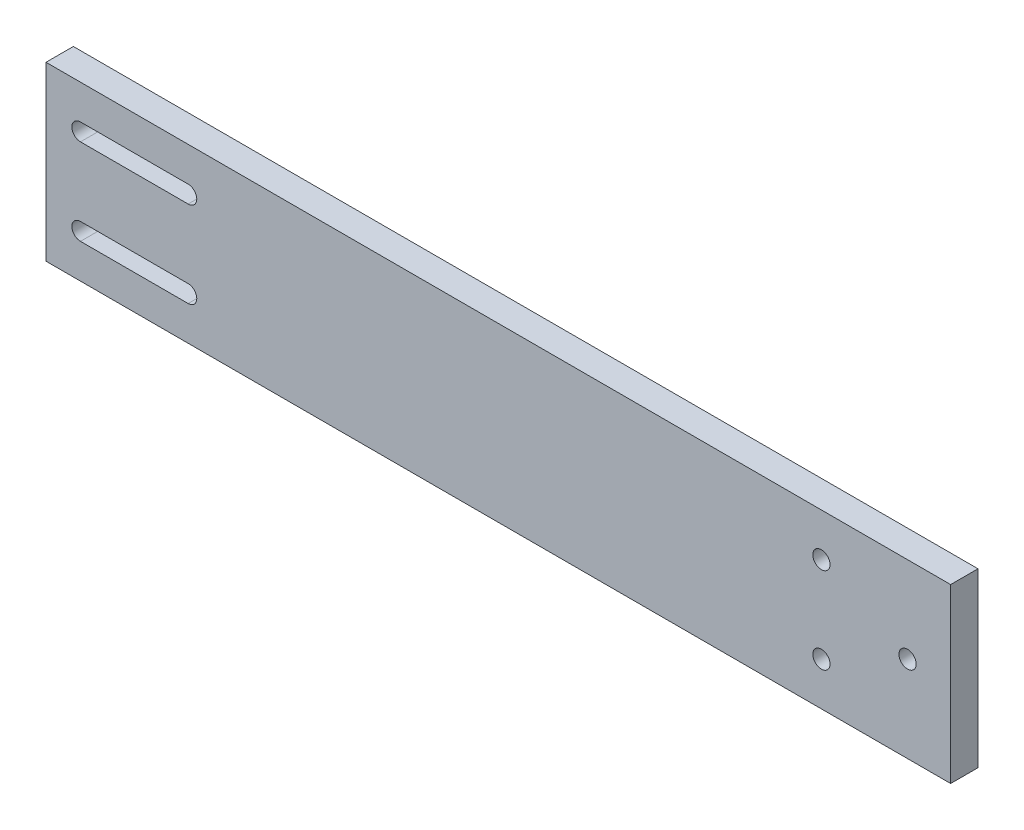
ISO-10303-21;
HEADER;
FILE_DESCRIPTION(('STEP AP214'),'2;1');
FILE_NAME('part.step','',(''),(''),'','','');
FILE_SCHEMA(('AUTOMOTIVE_DESIGN { 1 0 10303 214 1 1 1 1 }'));
ENDSEC;
DATA;
#1=APPLICATION_CONTEXT('core data for automotive mechanical design processes');
#2=APPLICATION_PROTOCOL_DEFINITION('international standard','automotive_design',2000,#1);
#3=PRODUCT_CONTEXT('',#1,'mechanical');
#4=PRODUCT('Part','Part','',(#3));
#5=PRODUCT_RELATED_PRODUCT_CATEGORY('part','',(#4));
#6=PRODUCT_DEFINITION_FORMATION('','',#4);
#7=PRODUCT_DEFINITION_CONTEXT('part definition',#1,'design');
#8=PRODUCT_DEFINITION('design','',#6,#7);
#9=PRODUCT_DEFINITION_SHAPE('','',#8);
#10=(LENGTH_UNIT() NAMED_UNIT(*) SI_UNIT(.MILLI.,.METRE.));
#11=(NAMED_UNIT(*) PLANE_ANGLE_UNIT() SI_UNIT($,.RADIAN.));
#12=(NAMED_UNIT(*) SI_UNIT($,.STERADIAN.) SOLID_ANGLE_UNIT());
#13=UNCERTAINTY_MEASURE_WITH_UNIT(LENGTH_MEASURE(1.E-05),#10,'distance_accuracy_value','');
#14=(GEOMETRIC_REPRESENTATION_CONTEXT(3) GLOBAL_UNCERTAINTY_ASSIGNED_CONTEXT((#13)) GLOBAL_UNIT_ASSIGNED_CONTEXT((#10,
#11,#12)) REPRESENTATION_CONTEXT('',''));
#15=CARTESIAN_POINT('',(0.,0.,0.));
#16=DIRECTION('',(0.,0.,1.));
#17=DIRECTION('',(1.,0.,0.));
#18=AXIS2_PLACEMENT_3D('',#15,#16,#17);
#19=CARTESIAN_POINT('',(0.,0.,6.35));
#20=DIRECTION('',(0.,0.,-1.));
#21=DIRECTION('',(-1.,0.,0.));
#22=AXIS2_PLACEMENT_3D('',#19,#20,#21);
#23=PLANE('',#22);
#24=CARTESIAN_POINT('',(8.,30.,6.35));
#25=DIRECTION('',(0.,0.,1.));
#26=DIRECTION('',(1.,0.,0.));
#27=AXIS2_PLACEMENT_3D('',#24,#25,#26);
#28=CIRCLE('',#27,2.);
#29=CARTESIAN_POINT('',(8.,32.,6.35));
#30=VERTEX_POINT('',#29);
#31=CARTESIAN_POINT('',(8.,28.,6.35));
#32=VERTEX_POINT('',#31);
#33=EDGE_CURVE('E180',#30,#32,#28,.T.);
#34=ORIENTED_EDGE('',*,*,#33,.F.);
#35=DIRECTION('',(-1.,0.,0.));
#36=VECTOR('',#35,1.);
#37=CARTESIAN_POINT('',(8.,32.,6.35));
#38=LINE('',#37,#36);
#39=CARTESIAN_POINT('',(33.,32.,6.35));
#40=VERTEX_POINT('',#39);
#41=EDGE_CURVE('E191',#40,#30,#38,.T.);
#42=ORIENTED_EDGE('',*,*,#41,.F.);
#43=CARTESIAN_POINT('',(33.,30.,6.35));
#44=DIRECTION('',(0.,0.,1.));
#45=DIRECTION('',(-1.,0.,0.));
#46=AXIS2_PLACEMENT_3D('',#43,#44,#45);
#47=CIRCLE('',#46,2.);
#48=CARTESIAN_POINT('',(33.,28.,6.35));
#49=VERTEX_POINT('',#48);
#50=EDGE_CURVE('E187',#49,#40,#47,.T.);
#51=ORIENTED_EDGE('',*,*,#50,.F.);
#52=DIRECTION('',(1.,0.,0.));
#53=VECTOR('',#52,1.);
#54=CARTESIAN_POINT('',(8.,28.,6.35));
#55=LINE('',#54,#53);
#56=EDGE_CURVE('E183',#32,#49,#55,.T.);
#57=ORIENTED_EDGE('',*,*,#56,.F.);
#58=EDGE_LOOP('',(#34,#42,#51,#57));
#59=FACE_BOUND('',#58,.T.);
#60=DIRECTION('',(0.,-1.,0.));
#61=VECTOR('',#60,1.);
#62=CARTESIAN_POINT('',(0.,0.,6.35));
#63=LINE('',#62,#61);
#64=CARTESIAN_POINT('',(0.,40.,6.35));
#65=VERTEX_POINT('',#64);
#66=CARTESIAN_POINT('',(0.,0.,6.35));
#67=VERTEX_POINT('',#66);
#68=EDGE_CURVE('E239',#65,#67,#63,.T.);
#69=ORIENTED_EDGE('',*,*,#68,.T.);
#70=DIRECTION('',(1.,0.,0.));
#71=VECTOR('',#70,1.);
#72=CARTESIAN_POINT('',(0.,0.,6.35));
#73=LINE('',#72,#71);
#74=CARTESIAN_POINT('',(210.,0.,6.35));
#75=VERTEX_POINT('',#74);
#76=EDGE_CURVE('E243',#67,#75,#73,.T.);
#77=ORIENTED_EDGE('',*,*,#76,.T.);
#78=DIRECTION('',(0.,1.,0.));
#79=VECTOR('',#78,1.);
#80=CARTESIAN_POINT('',(210.,0.,6.35));
#81=LINE('',#80,#79);
#82=CARTESIAN_POINT('',(210.,40.,6.35));
#83=VERTEX_POINT('',#82);
#84=EDGE_CURVE('E247',#75,#83,#81,.T.);
#85=ORIENTED_EDGE('',*,*,#84,.T.);
#86=DIRECTION('',(-1.,0.,0.));
#87=VECTOR('',#86,1.);
#88=CARTESIAN_POINT('',(0.,40.,6.35));
#89=LINE('',#88,#87);
#90=EDGE_CURVE('E250',#83,#65,#89,.T.);
#91=ORIENTED_EDGE('',*,*,#90,.T.);
#92=EDGE_LOOP('',(#69,#77,#85,#91));
#93=FACE_BOUND('',#92,.T.);
#94=CARTESIAN_POINT('',(180.,30.,6.35));
#95=DIRECTION('',(0.,0.,1.));
#96=DIRECTION('',(1.,0.,0.));
#97=AXIS2_PLACEMENT_3D('',#94,#95,#96);
#98=CIRCLE('',#97,2.);
#99=CARTESIAN_POINT('',(182.,30.,6.35));
#100=VERTEX_POINT('',#99);
#101=EDGE_CURVE('E231',#100,#100,#98,.T.);
#102=ORIENTED_EDGE('',*,*,#101,.F.);
#103=EDGE_LOOP('',(#102));
#104=FACE_BOUND('',#103,.T.);
#105=CARTESIAN_POINT('',(180.,10.,6.35));
#106=DIRECTION('',(0.,0.,1.));
#107=DIRECTION('',(1.,0.,0.));
#108=AXIS2_PLACEMENT_3D('',#105,#106,#107);
#109=CIRCLE('',#108,2.);
#110=CARTESIAN_POINT('',(182.,10.,6.35));
#111=VERTEX_POINT('',#110);
#112=EDGE_CURVE('E223',#111,#111,#109,.T.);
#113=ORIENTED_EDGE('',*,*,#112,.F.);
#114=EDGE_LOOP('',(#113));
#115=FACE_BOUND('',#114,.T.);
#116=CARTESIAN_POINT('',(8.,10.,6.35));
#117=DIRECTION('',(0.,0.,1.));
#118=DIRECTION('',(1.,0.,0.));
#119=AXIS2_PLACEMENT_3D('',#116,#117,#118);
#120=CIRCLE('',#119,2.);
#121=CARTESIAN_POINT('',(8.,12.,6.35));
#122=VERTEX_POINT('',#121);
#123=CARTESIAN_POINT('',(8.,8.,6.35));
#124=VERTEX_POINT('',#123);
#125=EDGE_CURVE('E129',#122,#124,#120,.T.);
#126=ORIENTED_EDGE('',*,*,#125,.F.);
#127=DIRECTION('',(-1.,0.,0.));
#128=VECTOR('',#127,1.);
#129=CARTESIAN_POINT('',(8.,12.,6.35));
#130=LINE('',#129,#128);
#131=CARTESIAN_POINT('',(33.,12.,6.35));
#132=VERTEX_POINT('',#131);
#133=EDGE_CURVE('E156',#132,#122,#130,.T.);
#134=ORIENTED_EDGE('',*,*,#133,.F.);
#135=CARTESIAN_POINT('',(33.,10.,6.35));
#136=DIRECTION('',(0.,0.,1.));
#137=DIRECTION('',(-1.,0.,0.));
#138=AXIS2_PLACEMENT_3D('',#135,#136,#137);
#139=CIRCLE('',#138,2.);
#140=CARTESIAN_POINT('',(33.,8.,6.35));
#141=VERTEX_POINT('',#140);
#142=EDGE_CURVE('E152',#141,#132,#139,.T.);
#143=ORIENTED_EDGE('',*,*,#142,.F.);
#144=DIRECTION('',(1.,0.,0.));
#145=VECTOR('',#144,1.);
#146=CARTESIAN_POINT('',(8.,8.,6.35));
#147=LINE('',#146,#145);
#148=EDGE_CURVE('E138',#124,#141,#147,.T.);
#149=ORIENTED_EDGE('',*,*,#148,.F.);
#150=EDGE_LOOP('',(#126,#134,#143,#149));
#151=FACE_BOUND('',#150,.T.);
#152=CARTESIAN_POINT('',(200.,20.,6.35));
#153=DIRECTION('',(0.,0.,1.));
#154=DIRECTION('',(1.,0.,0.));
#155=AXIS2_PLACEMENT_3D('',#152,#153,#154);
#156=CIRCLE('',#155,2.);
#157=CARTESIAN_POINT('',(202.,20.,6.35));
#158=VERTEX_POINT('',#157);
#159=EDGE_CURVE('E164',#158,#158,#156,.T.);
#160=ORIENTED_EDGE('',*,*,#159,.F.);
#161=EDGE_LOOP('',(#160));
#162=FACE_BOUND('',#161,.T.);
#163=ADVANCED_FACE('F39',(#59,#93,#104,#115,#151,#162),#23,.F.);
#164=CARTESIAN_POINT('',(0.,0.,0.));
#165=DIRECTION('',(0.,0.,-1.));
#166=DIRECTION('',(-1.,0.,0.));
#167=AXIS2_PLACEMENT_3D('',#164,#165,#166);
#168=PLANE('',#167);
#169=DIRECTION('',(-1.,0.,0.));
#170=VECTOR('',#169,1.);
#171=CARTESIAN_POINT('',(8.,12.,0.));
#172=LINE('',#171,#170);
#173=CARTESIAN_POINT('',(33.,12.,0.));
#174=VERTEX_POINT('',#173);
#175=CARTESIAN_POINT('',(8.,12.,0.));
#176=VERTEX_POINT('',#175);
#177=EDGE_CURVE('E139',#174,#176,#172,.T.);
#178=ORIENTED_EDGE('',*,*,#177,.T.);
#179=CARTESIAN_POINT('',(8.,10.,0.));
#180=DIRECTION('',(0.,0.,1.));
#181=DIRECTION('',(1.,0.,0.));
#182=AXIS2_PLACEMENT_3D('',#179,#180,#181);
#183=CIRCLE('',#182,2.);
#184=CARTESIAN_POINT('',(8.,8.,0.));
#185=VERTEX_POINT('',#184);
#186=EDGE_CURVE('E63',#176,#185,#183,.T.);
#187=ORIENTED_EDGE('',*,*,#186,.T.);
#188=DIRECTION('',(1.,0.,0.));
#189=VECTOR('',#188,1.);
#190=CARTESIAN_POINT('',(8.,8.,0.));
#191=LINE('',#190,#189);
#192=CARTESIAN_POINT('',(33.,8.,0.));
#193=VERTEX_POINT('',#192);
#194=EDGE_CURVE('E145',#185,#193,#191,.T.);
#195=ORIENTED_EDGE('',*,*,#194,.T.);
#196=CARTESIAN_POINT('',(33.,10.,0.));
#197=DIRECTION('',(0.,0.,1.));
#198=DIRECTION('',(-1.,0.,0.));
#199=AXIS2_PLACEMENT_3D('',#196,#197,#198);
#200=CIRCLE('',#199,2.);
#201=EDGE_CURVE('E167',#193,#174,#200,.T.);
#202=ORIENTED_EDGE('',*,*,#201,.T.);
#203=EDGE_LOOP('',(#178,#187,#195,#202));
#204=FACE_BOUND('',#203,.T.);
#205=DIRECTION('',(-1.,0.,0.));
#206=VECTOR('',#205,1.);
#207=CARTESIAN_POINT('',(8.,32.,0.));
#208=LINE('',#207,#206);
#209=CARTESIAN_POINT('',(33.,32.,0.));
#210=VERTEX_POINT('',#209);
#211=CARTESIAN_POINT('',(8.,32.,0.));
#212=VERTEX_POINT('',#211);
#213=EDGE_CURVE('E184',#210,#212,#208,.T.);
#214=ORIENTED_EDGE('',*,*,#213,.T.);
#215=CARTESIAN_POINT('',(8.,30.,0.));
#216=DIRECTION('',(0.,0.,1.));
#217=DIRECTION('',(1.,0.,0.));
#218=AXIS2_PLACEMENT_3D('',#215,#216,#217);
#219=CIRCLE('',#218,2.);
#220=CARTESIAN_POINT('',(8.,28.,0.));
#221=VERTEX_POINT('',#220);
#222=EDGE_CURVE('E147',#212,#221,#219,.T.);
#223=ORIENTED_EDGE('',*,*,#222,.T.);
#224=DIRECTION('',(1.,0.,0.));
#225=VECTOR('',#224,1.);
#226=CARTESIAN_POINT('',(8.,28.,0.));
#227=LINE('',#226,#225);
#228=CARTESIAN_POINT('',(33.,28.,0.));
#229=VERTEX_POINT('',#228);
#230=EDGE_CURVE('E198',#221,#229,#227,.T.);
#231=ORIENTED_EDGE('',*,*,#230,.T.);
#232=CARTESIAN_POINT('',(33.,30.,0.));
#233=DIRECTION('',(0.,0.,1.));
#234=DIRECTION('',(-1.,0.,0.));
#235=AXIS2_PLACEMENT_3D('',#232,#233,#234);
#236=CIRCLE('',#235,2.);
#237=EDGE_CURVE('E202',#229,#210,#236,.T.);
#238=ORIENTED_EDGE('',*,*,#237,.T.);
#239=EDGE_LOOP('',(#214,#223,#231,#238));
#240=FACE_BOUND('',#239,.T.);
#241=CARTESIAN_POINT('',(180.,10.,0.));
#242=DIRECTION('',(0.,0.,1.));
#243=DIRECTION('',(1.,0.,0.));
#244=AXIS2_PLACEMENT_3D('',#241,#242,#243);
#245=CIRCLE('',#244,2.);
#246=CARTESIAN_POINT('',(182.,10.,0.));
#247=VERTEX_POINT('',#246);
#248=EDGE_CURVE('E222',#247,#247,#245,.T.);
#249=ORIENTED_EDGE('',*,*,#248,.T.);
#250=EDGE_LOOP('',(#249));
#251=FACE_BOUND('',#250,.T.);
#252=DIRECTION('',(0.,-1.,0.));
#253=VECTOR('',#252,1.);
#254=CARTESIAN_POINT('',(0.,0.,0.));
#255=LINE('',#254,#253);
#256=CARTESIAN_POINT('',(0.,40.,0.));
#257=VERTEX_POINT('',#256);
#258=CARTESIAN_POINT('',(0.,0.,0.));
#259=VERTEX_POINT('',#258);
#260=EDGE_CURVE('E235',#257,#259,#255,.T.);
#261=ORIENTED_EDGE('',*,*,#260,.F.);
#262=DIRECTION('',(-1.,0.,0.));
#263=VECTOR('',#262,1.);
#264=CARTESIAN_POINT('',(0.,40.,0.));
#265=LINE('',#264,#263);
#266=CARTESIAN_POINT('',(210.,40.,0.));
#267=VERTEX_POINT('',#266);
#268=EDGE_CURVE('E244',#267,#257,#265,.T.);
#269=ORIENTED_EDGE('',*,*,#268,.F.);
#270=DIRECTION('',(0.,1.,0.));
#271=VECTOR('',#270,1.);
#272=CARTESIAN_POINT('',(210.,0.,0.));
#273=LINE('',#272,#271);
#274=CARTESIAN_POINT('',(210.,0.,0.));
#275=VERTEX_POINT('',#274);
#276=EDGE_CURVE('E260',#275,#267,#273,.T.);
#277=ORIENTED_EDGE('',*,*,#276,.F.);
#278=DIRECTION('',(1.,0.,0.));
#279=VECTOR('',#278,1.);
#280=CARTESIAN_POINT('',(0.,0.,0.));
#281=LINE('',#280,#279);
#282=EDGE_CURVE('E257',#259,#275,#281,.T.);
#283=ORIENTED_EDGE('',*,*,#282,.F.);
#284=EDGE_LOOP('',(#261,#269,#277,#283));
#285=FACE_BOUND('',#284,.T.);
#286=CARTESIAN_POINT('',(180.,30.,0.));
#287=DIRECTION('',(0.,0.,1.));
#288=DIRECTION('',(1.,0.,0.));
#289=AXIS2_PLACEMENT_3D('',#286,#287,#288);
#290=CIRCLE('',#289,2.);
#291=CARTESIAN_POINT('',(182.,30.,0.));
#292=VERTEX_POINT('',#291);
#293=EDGE_CURVE('E227',#292,#292,#290,.T.);
#294=ORIENTED_EDGE('',*,*,#293,.T.);
#295=EDGE_LOOP('',(#294));
#296=FACE_BOUND('',#295,.T.);
#297=CARTESIAN_POINT('',(200.,20.,0.));
#298=DIRECTION('',(0.,0.,1.));
#299=DIRECTION('',(1.,0.,0.));
#300=AXIS2_PLACEMENT_3D('',#297,#298,#299);
#301=CIRCLE('',#300,2.);
#302=CARTESIAN_POINT('',(202.,20.,0.));
#303=VERTEX_POINT('',#302);
#304=EDGE_CURVE('E331',#303,#303,#301,.T.);
#305=ORIENTED_EDGE('',*,*,#304,.T.);
#306=EDGE_LOOP('',(#305));
#307=FACE_BOUND('',#306,.T.);
#308=ADVANCED_FACE('F283',(#204,#240,#251,#285,#296,#307),#168,.T.);
#309=CARTESIAN_POINT('',(0.,0.,6.35));
#310=DIRECTION('',(1.,0.,0.));
#311=DIRECTION('',(0.,0.,-1.));
#312=AXIS2_PLACEMENT_3D('',#309,#310,#311);
#313=PLANE('',#312);
#314=ORIENTED_EDGE('',*,*,#260,.T.);
#315=DIRECTION('',(0.,0.,-1.));
#316=VECTOR('',#315,1.);
#317=CARTESIAN_POINT('',(0.,0.,6.35));
#318=LINE('',#317,#316);
#319=EDGE_CURVE('E11',#67,#259,#318,.T.);
#320=ORIENTED_EDGE('',*,*,#319,.F.);
#321=ORIENTED_EDGE('',*,*,#68,.F.);
#322=DIRECTION('',(0.,0.,-1.));
#323=VECTOR('',#322,1.);
#324=CARTESIAN_POINT('',(0.,40.,6.35));
#325=LINE('',#324,#323);
#326=EDGE_CURVE('E253',#65,#257,#325,.T.);
#327=ORIENTED_EDGE('',*,*,#326,.T.);
#328=EDGE_LOOP('',(#314,#320,#321,#327));
#329=FACE_BOUND('',#328,.T.);
#330=ADVANCED_FACE('F41',(#329),#313,.F.);
#331=CARTESIAN_POINT('',(0.,0.,6.35));
#332=DIRECTION('',(0.,1.,0.));
#333=DIRECTION('',(-1.,0.,0.));
#334=AXIS2_PLACEMENT_3D('',#331,#332,#333);
#335=PLANE('',#334);
#336=ORIENTED_EDGE('',*,*,#282,.T.);
#337=DIRECTION('',(0.,0.,-1.));
#338=VECTOR('',#337,1.);
#339=CARTESIAN_POINT('',(210.,0.,6.35));
#340=LINE('',#339,#338);
#341=EDGE_CURVE('E48',#75,#275,#340,.T.);
#342=ORIENTED_EDGE('',*,*,#341,.F.);
#343=ORIENTED_EDGE('',*,*,#76,.F.);
#344=ORIENTED_EDGE('',*,*,#319,.T.);
#345=EDGE_LOOP('',(#336,#342,#343,#344));
#346=FACE_BOUND('',#345,.T.);
#347=ADVANCED_FACE('F294',(#346),#335,.F.);
#348=CARTESIAN_POINT('',(210.,0.,6.35));
#349=DIRECTION('',(-1.,0.,0.));
#350=DIRECTION('',(0.,-1.,0.));
#351=AXIS2_PLACEMENT_3D('',#348,#349,#350);
#352=PLANE('',#351);
#353=ORIENTED_EDGE('',*,*,#276,.T.);
#354=DIRECTION('',(0.,0.,-1.));
#355=VECTOR('',#354,1.);
#356=CARTESIAN_POINT('',(210.,40.,6.35));
#357=LINE('',#356,#355);
#358=EDGE_CURVE('E268',#83,#267,#357,.T.);
#359=ORIENTED_EDGE('',*,*,#358,.F.);
#360=ORIENTED_EDGE('',*,*,#84,.F.);
#361=ORIENTED_EDGE('',*,*,#341,.T.);
#362=EDGE_LOOP('',(#353,#359,#360,#361));
#363=FACE_BOUND('',#362,.T.);
#364=ADVANCED_FACE('F277',(#363),#352,.F.);
#365=CARTESIAN_POINT('',(0.,40.,6.35));
#366=DIRECTION('',(0.,-1.,0.));
#367=DIRECTION('',(1.,0.,0.));
#368=AXIS2_PLACEMENT_3D('',#365,#366,#367);
#369=PLANE('',#368);
#370=ORIENTED_EDGE('',*,*,#268,.T.);
#371=ORIENTED_EDGE('',*,*,#326,.F.);
#372=ORIENTED_EDGE('',*,*,#90,.F.);
#373=ORIENTED_EDGE('',*,*,#358,.T.);
#374=EDGE_LOOP('',(#370,#371,#372,#373));
#375=FACE_BOUND('',#374,.T.);
#376=ADVANCED_FACE('F287',(#375),#369,.F.);
#377=CARTESIAN_POINT('',(180.,30.,6.35));
#378=DIRECTION('',(0.,0.,-1.));
#379=DIRECTION('',(-1.,0.,0.));
#380=AXIS2_PLACEMENT_3D('',#377,#378,#379);
#381=CYLINDRICAL_SURFACE('',#380,2.);
#382=ORIENTED_EDGE('',*,*,#101,.T.);
#383=EDGE_LOOP('',(#382));
#384=FACE_BOUND('',#383,.T.);
#385=ORIENTED_EDGE('',*,*,#293,.F.);
#386=EDGE_LOOP('',(#385));
#387=FACE_BOUND('',#386,.T.);
#388=ADVANCED_FACE('F311',(#384,#387),#381,.F.);
#389=CARTESIAN_POINT('',(180.,10.,6.35));
#390=DIRECTION('',(0.,0.,-1.));
#391=DIRECTION('',(-1.,0.,0.));
#392=AXIS2_PLACEMENT_3D('',#389,#390,#391);
#393=CYLINDRICAL_SURFACE('',#392,2.);
#394=ORIENTED_EDGE('',*,*,#112,.T.);
#395=EDGE_LOOP('',(#394));
#396=FACE_BOUND('',#395,.T.);
#397=ORIENTED_EDGE('',*,*,#248,.F.);
#398=EDGE_LOOP('',(#397));
#399=FACE_BOUND('',#398,.T.);
#400=ADVANCED_FACE('F318',(#396,#399),#393,.F.);
#401=CARTESIAN_POINT('',(8.,30.,6.35));
#402=DIRECTION('',(0.,0.,-1.));
#403=DIRECTION('',(-1.,0.,0.));
#404=AXIS2_PLACEMENT_3D('',#401,#402,#403);
#405=CYLINDRICAL_SURFACE('',#404,2.);
#406=ORIENTED_EDGE('',*,*,#222,.F.);
#407=DIRECTION('',(0.,0.,-1.));
#408=VECTOR('',#407,1.);
#409=CARTESIAN_POINT('',(8.,32.,6.35));
#410=LINE('',#409,#408);
#411=EDGE_CURVE('E194',#30,#212,#410,.T.);
#412=ORIENTED_EDGE('',*,*,#411,.F.);
#413=ORIENTED_EDGE('',*,*,#33,.T.);
#414=DIRECTION('',(0.,0.,-1.));
#415=VECTOR('',#414,1.);
#416=CARTESIAN_POINT('',(8.,28.,6.35));
#417=LINE('',#416,#415);
#418=EDGE_CURVE('E218',#32,#221,#417,.T.);
#419=ORIENTED_EDGE('',*,*,#418,.T.);
#420=EDGE_LOOP('',(#406,#412,#413,#419));
#421=FACE_BOUND('',#420,.T.);
#422=ADVANCED_FACE('F323',(#421),#405,.F.);
#423=CARTESIAN_POINT('',(8.,28.,6.35));
#424=DIRECTION('',(0.,1.,0.));
#425=DIRECTION('',(-1.,0.,0.));
#426=AXIS2_PLACEMENT_3D('',#423,#424,#425);
#427=PLANE('',#426);
#428=ORIENTED_EDGE('',*,*,#230,.F.);
#429=ORIENTED_EDGE('',*,*,#418,.F.);
#430=ORIENTED_EDGE('',*,*,#56,.T.);
#431=DIRECTION('',(0.,0.,-1.));
#432=VECTOR('',#431,1.);
#433=CARTESIAN_POINT('',(33.,28.,6.35));
#434=LINE('',#433,#432);
#435=EDGE_CURVE('E215',#49,#229,#434,.T.);
#436=ORIENTED_EDGE('',*,*,#435,.T.);
#437=EDGE_LOOP('',(#428,#429,#430,#436));
#438=FACE_BOUND('',#437,.T.);
#439=ADVANCED_FACE('F363',(#438),#427,.T.);
#440=CARTESIAN_POINT('',(33.,30.,6.35));
#441=DIRECTION('',(0.,0.,-1.));
#442=DIRECTION('',(-1.,0.,0.));
#443=AXIS2_PLACEMENT_3D('',#440,#441,#442);
#444=CYLINDRICAL_SURFACE('',#443,2.);
#445=ORIENTED_EDGE('',*,*,#237,.F.);
#446=ORIENTED_EDGE('',*,*,#435,.F.);
#447=ORIENTED_EDGE('',*,*,#50,.T.);
#448=DIRECTION('',(0.,0.,-1.));
#449=VECTOR('',#448,1.);
#450=CARTESIAN_POINT('',(33.,32.,6.35));
#451=LINE('',#450,#449);
#452=EDGE_CURVE('E212',#40,#210,#451,.T.);
#453=ORIENTED_EDGE('',*,*,#452,.T.);
#454=EDGE_LOOP('',(#445,#446,#447,#453));
#455=FACE_BOUND('',#454,.T.);
#456=ADVANCED_FACE('F359',(#455),#444,.F.);
#457=CARTESIAN_POINT('',(8.,32.,6.35));
#458=DIRECTION('',(0.,-1.,0.));
#459=DIRECTION('',(0.,0.,-1.));
#460=AXIS2_PLACEMENT_3D('',#457,#458,#459);
#461=PLANE('',#460);
#462=ORIENTED_EDGE('',*,*,#213,.F.);
#463=ORIENTED_EDGE('',*,*,#452,.F.);
#464=ORIENTED_EDGE('',*,*,#41,.T.);
#465=ORIENTED_EDGE('',*,*,#411,.T.);
#466=EDGE_LOOP('',(#462,#463,#464,#465));
#467=FACE_BOUND('',#466,.T.);
#468=ADVANCED_FACE('F356',(#467),#461,.T.);
#469=CARTESIAN_POINT('',(8.,10.,6.35));
#470=DIRECTION('',(0.,0.,-1.));
#471=DIRECTION('',(-1.,0.,0.));
#472=AXIS2_PLACEMENT_3D('',#469,#470,#471);
#473=CYLINDRICAL_SURFACE('',#472,2.);
#474=ORIENTED_EDGE('',*,*,#186,.F.);
#475=DIRECTION('',(0.,0.,-1.));
#476=VECTOR('',#475,1.);
#477=CARTESIAN_POINT('',(8.,12.,6.35));
#478=LINE('',#477,#476);
#479=EDGE_CURVE('E133',#122,#176,#478,.T.);
#480=ORIENTED_EDGE('',*,*,#479,.F.);
#481=ORIENTED_EDGE('',*,*,#125,.T.);
#482=DIRECTION('',(0.,0.,-1.));
#483=VECTOR('',#482,1.);
#484=CARTESIAN_POINT('',(8.,8.,6.35));
#485=LINE('',#484,#483);
#486=EDGE_CURVE('E132',#124,#185,#485,.T.);
#487=ORIENTED_EDGE('',*,*,#486,.T.);
#488=EDGE_LOOP('',(#474,#480,#481,#487));
#489=FACE_BOUND('',#488,.T.);
#490=ADVANCED_FACE('F131',(#489),#473,.F.);
#491=CARTESIAN_POINT('',(8.,8.,6.35));
#492=DIRECTION('',(0.,1.,0.));
#493=DIRECTION('',(-1.,0.,0.));
#494=AXIS2_PLACEMENT_3D('',#491,#492,#493);
#495=PLANE('',#494);
#496=ORIENTED_EDGE('',*,*,#194,.F.);
#497=ORIENTED_EDGE('',*,*,#486,.F.);
#498=ORIENTED_EDGE('',*,*,#148,.T.);
#499=DIRECTION('',(0.,0.,-1.));
#500=VECTOR('',#499,1.);
#501=CARTESIAN_POINT('',(33.,8.,6.35));
#502=LINE('',#501,#500);
#503=EDGE_CURVE('E148',#141,#193,#502,.T.);
#504=ORIENTED_EDGE('',*,*,#503,.T.);
#505=EDGE_LOOP('',(#496,#497,#498,#504));
#506=FACE_BOUND('',#505,.T.);
#507=ADVANCED_FACE('F142',(#506),#495,.T.);
#508=CARTESIAN_POINT('',(33.,10.,6.35));
#509=DIRECTION('',(0.,0.,-1.));
#510=DIRECTION('',(-1.,0.,0.));
#511=AXIS2_PLACEMENT_3D('',#508,#509,#510);
#512=CYLINDRICAL_SURFACE('',#511,2.);
#513=ORIENTED_EDGE('',*,*,#201,.F.);
#514=ORIENTED_EDGE('',*,*,#503,.F.);
#515=ORIENTED_EDGE('',*,*,#142,.T.);
#516=DIRECTION('',(0.,0.,-1.));
#517=VECTOR('',#516,1.);
#518=CARTESIAN_POINT('',(33.,12.,6.35));
#519=LINE('',#518,#517);
#520=EDGE_CURVE('E55',#132,#174,#519,.T.);
#521=ORIENTED_EDGE('',*,*,#520,.T.);
#522=EDGE_LOOP('',(#513,#514,#515,#521));
#523=FACE_BOUND('',#522,.T.);
#524=ADVANCED_FACE('F346',(#523),#512,.F.);
#525=CARTESIAN_POINT('',(8.,12.,6.35));
#526=DIRECTION('',(0.,-1.,0.));
#527=DIRECTION('',(1.,0.,0.));
#528=AXIS2_PLACEMENT_3D('',#525,#526,#527);
#529=PLANE('',#528);
#530=ORIENTED_EDGE('',*,*,#177,.F.);
#531=ORIENTED_EDGE('',*,*,#520,.F.);
#532=ORIENTED_EDGE('',*,*,#133,.T.);
#533=ORIENTED_EDGE('',*,*,#479,.T.);
#534=EDGE_LOOP('',(#530,#531,#532,#533));
#535=FACE_BOUND('',#534,.T.);
#536=ADVANCED_FACE('F341',(#535),#529,.T.);
#537=CARTESIAN_POINT('',(200.,20.,6.35));
#538=DIRECTION('',(0.,0.,-1.));
#539=DIRECTION('',(-1.,0.,0.));
#540=AXIS2_PLACEMENT_3D('',#537,#538,#539);
#541=CYLINDRICAL_SURFACE('',#540,2.);
#542=ORIENTED_EDGE('',*,*,#159,.T.);
#543=EDGE_LOOP('',(#542));
#544=FACE_BOUND('',#543,.T.);
#545=ORIENTED_EDGE('',*,*,#304,.F.);
#546=EDGE_LOOP('',(#545));
#547=FACE_BOUND('',#546,.T.);
#548=ADVANCED_FACE('F339',(#544,#547),#541,.F.);
#549=CLOSED_SHELL('',(#163,#308,#330,#347,#364,#376,#388,#400,#422,#439,#456,#468,#490,#507,
#524,#536,#548));
#550=MANIFOLD_SOLID_BREP('B2',#549);
#551=ADVANCED_BREP_SHAPE_REPRESENTATION('',(#18,#550),#14);
#552=SHAPE_DEFINITION_REPRESENTATION(#9,#551);
ENDSEC;
END-ISO-10303-21;
